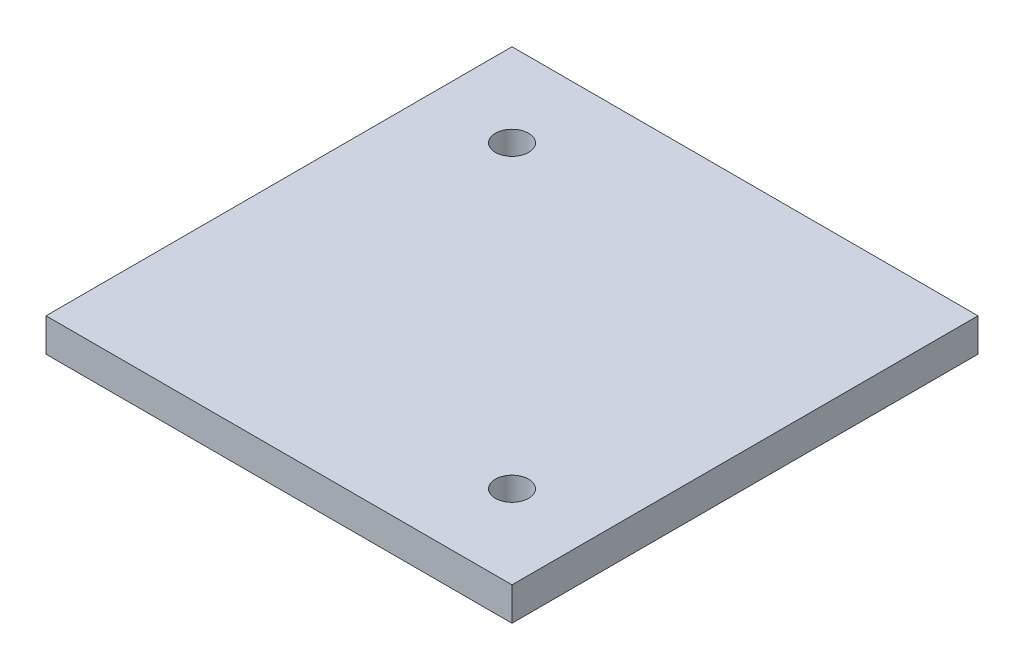
ISO-10303-21;
HEADER;
FILE_DESCRIPTION(('STEP AP214'),'2;1');
FILE_NAME('part.step','',(''),(''),'','','');
FILE_SCHEMA(('AUTOMOTIVE_DESIGN { 1 0 10303 214 1 1 1 1 }'));
ENDSEC;
DATA;
#1=APPLICATION_CONTEXT('core data for automotive mechanical design processes');
#2=APPLICATION_PROTOCOL_DEFINITION('international standard','automotive_design',2000,#1);
#3=PRODUCT_CONTEXT('',#1,'mechanical');
#4=PRODUCT('Part','Part','',(#3));
#5=PRODUCT_RELATED_PRODUCT_CATEGORY('part','',(#4));
#6=PRODUCT_DEFINITION_FORMATION('','',#4);
#7=PRODUCT_DEFINITION_CONTEXT('part definition',#1,'design');
#8=PRODUCT_DEFINITION('design','',#6,#7);
#9=PRODUCT_DEFINITION_SHAPE('','',#8);
#10=(LENGTH_UNIT() NAMED_UNIT(*) SI_UNIT(.MILLI.,.METRE.));
#11=(NAMED_UNIT(*) PLANE_ANGLE_UNIT() SI_UNIT($,.RADIAN.));
#12=(NAMED_UNIT(*) SI_UNIT($,.STERADIAN.) SOLID_ANGLE_UNIT());
#13=UNCERTAINTY_MEASURE_WITH_UNIT(LENGTH_MEASURE(1.E-05),#10,'distance_accuracy_value','');
#14=(GEOMETRIC_REPRESENTATION_CONTEXT(3) GLOBAL_UNCERTAINTY_ASSIGNED_CONTEXT((#13)) GLOBAL_UNIT_ASSIGNED_CONTEXT((#10,
#11,#12)) REPRESENTATION_CONTEXT('',''));
#15=CARTESIAN_POINT('',(0.,0.,0.));
#16=DIRECTION('',(0.,0.,1.));
#17=DIRECTION('',(1.,0.,0.));
#18=AXIS2_PLACEMENT_3D('',#15,#16,#17);
#19=CARTESIAN_POINT('',(0.,3.175,0.));
#20=DIRECTION('',(0.,-1.,0.));
#21=DIRECTION('',(0.,0.,-1.));
#22=AXIS2_PLACEMENT_3D('',#19,#20,#21);
#23=PLANE('',#22);
#24=DIRECTION('',(0.,0.,1.));
#25=VECTOR('',#24,1.);
#26=CARTESIAN_POINT('',(0.,3.175,0.));
#27=LINE('',#26,#25);
#28=CARTESIAN_POINT('',(0.,3.175,-44.45));
#29=VERTEX_POINT('',#28);
#30=CARTESIAN_POINT('',(0.,3.175,0.));
#31=VERTEX_POINT('',#30);
#32=EDGE_CURVE('E88',#29,#31,#27,.T.);
#33=ORIENTED_EDGE('',*,*,#32,.T.);
#34=DIRECTION('',(1.,0.,0.));
#35=VECTOR('',#34,1.);
#36=CARTESIAN_POINT('',(0.,3.175,0.));
#37=LINE('',#36,#35);
#38=CARTESIAN_POINT('',(44.45,3.175,0.));
#39=VERTEX_POINT('',#38);
#40=EDGE_CURVE('E83',#31,#39,#37,.T.);
#41=ORIENTED_EDGE('',*,*,#40,.T.);
#42=DIRECTION('',(0.,0.,-1.));
#43=VECTOR('',#42,1.);
#44=CARTESIAN_POINT('',(44.45,3.175,0.));
#45=LINE('',#44,#43);
#46=CARTESIAN_POINT('',(44.45,3.175,-44.45));
#47=VERTEX_POINT('',#46);
#48=EDGE_CURVE('E86',#39,#47,#45,.T.);
#49=ORIENTED_EDGE('',*,*,#48,.T.);
#50=DIRECTION('',(-1.,0.,0.));
#51=VECTOR('',#50,1.);
#52=CARTESIAN_POINT('',(0.,3.175,-44.45));
#53=LINE('',#52,#51);
#54=EDGE_CURVE('E53',#47,#29,#53,.T.);
#55=ORIENTED_EDGE('',*,*,#54,.T.);
#56=EDGE_LOOP('',(#33,#41,#49,#55));
#57=FACE_BOUND('',#56,.T.);
#58=CARTESIAN_POINT('',(7.9375,3.175,-36.5125));
#59=DIRECTION('',(0.,1.,0.));
#60=DIRECTION('',(0.,0.,1.));
#61=AXIS2_PLACEMENT_3D('',#58,#59,#60);
#62=CIRCLE('',#61,1.5875);
#63=CARTESIAN_POINT('',(7.9375,3.175,-34.925));
#64=VERTEX_POINT('',#63);
#65=EDGE_CURVE('E103',#64,#64,#62,.T.);
#66=ORIENTED_EDGE('',*,*,#65,.F.);
#67=EDGE_LOOP('',(#66));
#68=FACE_BOUND('',#67,.T.);
#69=CARTESIAN_POINT('',(36.5125,3.175,-7.9375));
#70=DIRECTION('',(0.,1.,0.));
#71=DIRECTION('',(0.,0.,1.));
#72=AXIS2_PLACEMENT_3D('',#69,#70,#71);
#73=CIRCLE('',#72,1.5875);
#74=CARTESIAN_POINT('',(36.5125,3.175,-6.35));
#75=VERTEX_POINT('',#74);
#76=EDGE_CURVE('E118',#75,#75,#73,.T.);
#77=ORIENTED_EDGE('',*,*,#76,.F.);
#78=EDGE_LOOP('',(#77));
#79=FACE_BOUND('',#78,.T.);
#80=ADVANCED_FACE('F36',(#57,#68,#79),#23,.F.);
#81=CARTESIAN_POINT('',(0.,0.,0.));
#82=DIRECTION('',(0.,-1.,0.));
#83=DIRECTION('',(0.,0.,-1.));
#84=AXIS2_PLACEMENT_3D('',#81,#82,#83);
#85=PLANE('',#84);
#86=CARTESIAN_POINT('',(7.9375,0.,-36.5125));
#87=DIRECTION('',(0.,1.,0.));
#88=DIRECTION('',(0.,0.,1.));
#89=AXIS2_PLACEMENT_3D('',#86,#87,#88);
#90=CIRCLE('',#89,1.5875);
#91=CARTESIAN_POINT('',(7.9375,0.,-34.925));
#92=VERTEX_POINT('',#91);
#93=EDGE_CURVE('E115',#92,#92,#90,.T.);
#94=ORIENTED_EDGE('',*,*,#93,.T.);
#95=EDGE_LOOP('',(#94));
#96=FACE_BOUND('',#95,.T.);
#97=DIRECTION('',(0.,0.,1.));
#98=VECTOR('',#97,1.);
#99=CARTESIAN_POINT('',(0.,0.,0.));
#100=LINE('',#99,#98);
#101=CARTESIAN_POINT('',(0.,0.,-44.45));
#102=VERTEX_POINT('',#101);
#103=CARTESIAN_POINT('',(0.,0.,0.));
#104=VERTEX_POINT('',#103);
#105=EDGE_CURVE('E100',#102,#104,#100,.T.);
#106=ORIENTED_EDGE('',*,*,#105,.F.);
#107=DIRECTION('',(-1.,0.,0.));
#108=VECTOR('',#107,1.);
#109=CARTESIAN_POINT('',(0.,0.,-44.45));
#110=LINE('',#109,#108);
#111=CARTESIAN_POINT('',(44.45,0.,-44.45));
#112=VERTEX_POINT('',#111);
#113=EDGE_CURVE('E76',#112,#102,#110,.T.);
#114=ORIENTED_EDGE('',*,*,#113,.F.);
#115=DIRECTION('',(0.,0.,-1.));
#116=VECTOR('',#115,1.);
#117=CARTESIAN_POINT('',(44.45,0.,0.));
#118=LINE('',#117,#116);
#119=CARTESIAN_POINT('',(44.45,0.,0.));
#120=VERTEX_POINT('',#119);
#121=EDGE_CURVE('E70',#120,#112,#118,.T.);
#122=ORIENTED_EDGE('',*,*,#121,.F.);
#123=DIRECTION('',(1.,0.,0.));
#124=VECTOR('',#123,1.);
#125=CARTESIAN_POINT('',(0.,0.,0.));
#126=LINE('',#125,#124);
#127=EDGE_CURVE('E92',#104,#120,#126,.T.);
#128=ORIENTED_EDGE('',*,*,#127,.F.);
#129=EDGE_LOOP('',(#106,#114,#122,#128));
#130=FACE_BOUND('',#129,.T.);
#131=CARTESIAN_POINT('',(36.5125,0.,-7.9375));
#132=DIRECTION('',(0.,1.,0.));
#133=DIRECTION('',(0.,0.,1.));
#134=AXIS2_PLACEMENT_3D('',#131,#132,#133);
#135=CIRCLE('',#134,1.5875);
#136=CARTESIAN_POINT('',(36.5125,0.,-6.35));
#137=VERTEX_POINT('',#136);
#138=EDGE_CURVE('E121',#137,#137,#135,.T.);
#139=ORIENTED_EDGE('',*,*,#138,.T.);
#140=EDGE_LOOP('',(#139));
#141=FACE_BOUND('',#140,.T.);
#142=ADVANCED_FACE('F111',(#96,#130,#141),#85,.T.);
#143=CARTESIAN_POINT('',(0.,3.175,0.));
#144=DIRECTION('',(1.,0.,0.));
#145=DIRECTION('',(0.,0.,-1.));
#146=AXIS2_PLACEMENT_3D('',#143,#144,#145);
#147=PLANE('',#146);
#148=ORIENTED_EDGE('',*,*,#105,.T.);
#149=DIRECTION('',(0.,-1.,0.));
#150=VECTOR('',#149,1.);
#151=CARTESIAN_POINT('',(0.,3.175,0.));
#152=LINE('',#151,#150);
#153=EDGE_CURVE('E11',#31,#104,#152,.T.);
#154=ORIENTED_EDGE('',*,*,#153,.F.);
#155=ORIENTED_EDGE('',*,*,#32,.F.);
#156=DIRECTION('',(0.,-1.,0.));
#157=VECTOR('',#156,1.);
#158=CARTESIAN_POINT('',(0.,3.175,-44.45));
#159=LINE('',#158,#157);
#160=EDGE_CURVE('E96',#29,#102,#159,.T.);
#161=ORIENTED_EDGE('',*,*,#160,.T.);
#162=EDGE_LOOP('',(#148,#154,#155,#161));
#163=FACE_BOUND('',#162,.T.);
#164=ADVANCED_FACE('F38',(#163),#147,.F.);
#165=CARTESIAN_POINT('',(0.,3.175,0.));
#166=DIRECTION('',(0.,0.,-1.));
#167=DIRECTION('',(-1.,0.,0.));
#168=AXIS2_PLACEMENT_3D('',#165,#166,#167);
#169=PLANE('',#168);
#170=ORIENTED_EDGE('',*,*,#127,.T.);
#171=DIRECTION('',(0.,-1.,0.));
#172=VECTOR('',#171,1.);
#173=CARTESIAN_POINT('',(44.45,3.175,0.));
#174=LINE('',#173,#172);
#175=EDGE_CURVE('E45',#39,#120,#174,.T.);
#176=ORIENTED_EDGE('',*,*,#175,.F.);
#177=ORIENTED_EDGE('',*,*,#40,.F.);
#178=ORIENTED_EDGE('',*,*,#153,.T.);
#179=EDGE_LOOP('',(#170,#176,#177,#178));
#180=FACE_BOUND('',#179,.T.);
#181=ADVANCED_FACE('F91',(#180),#169,.F.);
#182=CARTESIAN_POINT('',(44.45,3.175,0.));
#183=DIRECTION('',(-1.,0.,0.));
#184=DIRECTION('',(0.,0.,1.));
#185=AXIS2_PLACEMENT_3D('',#182,#183,#184);
#186=PLANE('',#185);
#187=ORIENTED_EDGE('',*,*,#121,.T.);
#188=DIRECTION('',(0.,-1.,0.));
#189=VECTOR('',#188,1.);
#190=CARTESIAN_POINT('',(44.45,3.175,-44.45));
#191=LINE('',#190,#189);
#192=EDGE_CURVE('E93',#47,#112,#191,.T.);
#193=ORIENTED_EDGE('',*,*,#192,.F.);
#194=ORIENTED_EDGE('',*,*,#48,.F.);
#195=ORIENTED_EDGE('',*,*,#175,.T.);
#196=EDGE_LOOP('',(#187,#193,#194,#195));
#197=FACE_BOUND('',#196,.T.);
#198=ADVANCED_FACE('F94',(#197),#186,.F.);
#199=CARTESIAN_POINT('',(0.,3.175,-44.45));
#200=DIRECTION('',(0.,0.,1.));
#201=DIRECTION('',(1.,0.,0.));
#202=AXIS2_PLACEMENT_3D('',#199,#200,#201);
#203=PLANE('',#202);
#204=ORIENTED_EDGE('',*,*,#113,.T.);
#205=ORIENTED_EDGE('',*,*,#160,.F.);
#206=ORIENTED_EDGE('',*,*,#54,.F.);
#207=ORIENTED_EDGE('',*,*,#192,.T.);
#208=EDGE_LOOP('',(#204,#205,#206,#207));
#209=FACE_BOUND('',#208,.T.);
#210=ADVANCED_FACE('F108',(#209),#203,.F.);
#211=CARTESIAN_POINT('',(7.9375,3.175,-36.5125));
#212=DIRECTION('',(0.,-1.,0.));
#213=DIRECTION('',(0.,0.,-1.));
#214=AXIS2_PLACEMENT_3D('',#211,#212,#213);
#215=CYLINDRICAL_SURFACE('',#214,1.5875);
#216=ORIENTED_EDGE('',*,*,#65,.T.);
#217=EDGE_LOOP('',(#216));
#218=FACE_BOUND('',#217,.T.);
#219=ORIENTED_EDGE('',*,*,#93,.F.);
#220=EDGE_LOOP('',(#219));
#221=FACE_BOUND('',#220,.T.);
#222=ADVANCED_FACE('F138',(#218,#221),#215,.F.);
#223=CARTESIAN_POINT('',(36.5125,3.175,-7.9375));
#224=DIRECTION('',(0.,-1.,0.));
#225=DIRECTION('',(0.,0.,-1.));
#226=AXIS2_PLACEMENT_3D('',#223,#224,#225);
#227=CYLINDRICAL_SURFACE('',#226,1.5875);
#228=ORIENTED_EDGE('',*,*,#76,.T.);
#229=EDGE_LOOP('',(#228));
#230=FACE_BOUND('',#229,.T.);
#231=ORIENTED_EDGE('',*,*,#138,.F.);
#232=EDGE_LOOP('',(#231));
#233=FACE_BOUND('',#232,.T.);
#234=ADVANCED_FACE('F127',(#230,#233),#227,.F.);
#235=CLOSED_SHELL('',(#80,#142,#164,#181,#198,#210,#222,#234));
#236=MANIFOLD_SOLID_BREP('B2',#235);
#237=ADVANCED_BREP_SHAPE_REPRESENTATION('',(#18,#236),#14);
#238=SHAPE_DEFINITION_REPRESENTATION(#9,#237);
ENDSEC;
END-ISO-10303-21;
